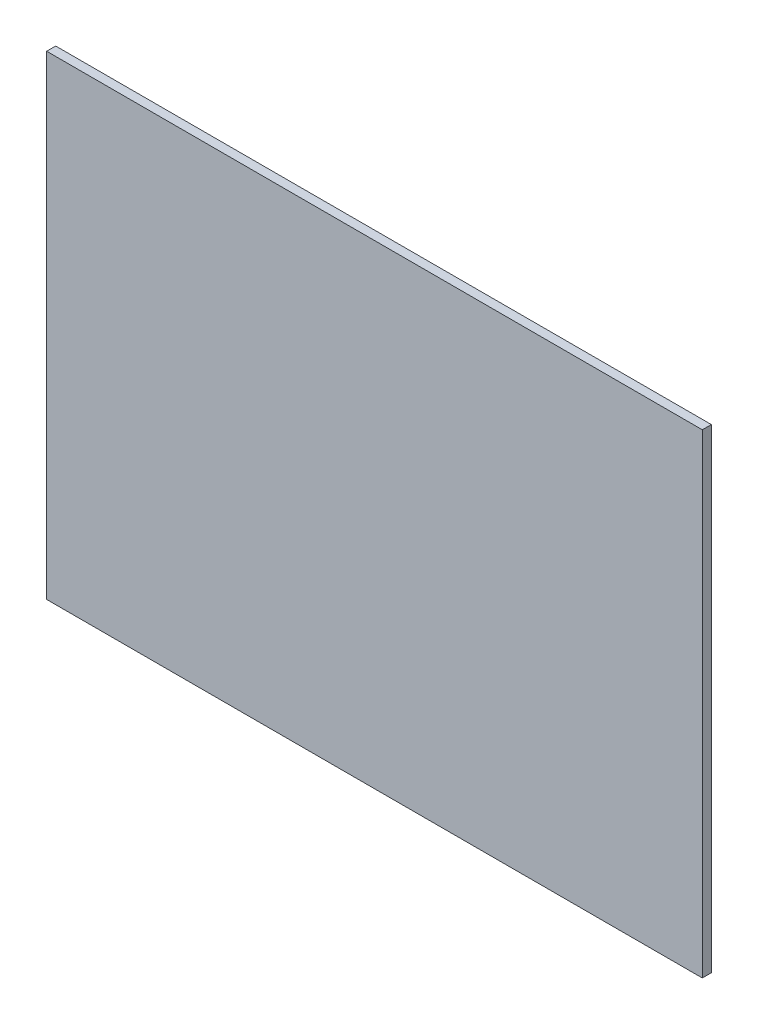
ISO-10303-21;
HEADER;
FILE_DESCRIPTION(('STEP AP214'),'2;1');
FILE_NAME('part.step','',(''),(''),'','','');
FILE_SCHEMA(('AUTOMOTIVE_DESIGN { 1 0 10303 214 1 1 1 1 }'));
ENDSEC;
DATA;
#1=APPLICATION_CONTEXT('core data for automotive mechanical design processes');
#2=APPLICATION_PROTOCOL_DEFINITION('international standard','automotive_design',2000,#1);
#3=PRODUCT_CONTEXT('',#1,'mechanical');
#4=PRODUCT('Part','Part','',(#3));
#5=PRODUCT_RELATED_PRODUCT_CATEGORY('part','',(#4));
#6=PRODUCT_DEFINITION_FORMATION('','',#4);
#7=PRODUCT_DEFINITION_CONTEXT('part definition',#1,'design');
#8=PRODUCT_DEFINITION('design','',#6,#7);
#9=PRODUCT_DEFINITION_SHAPE('','',#8);
#10=(LENGTH_UNIT() NAMED_UNIT(*) SI_UNIT(.MILLI.,.METRE.));
#11=(NAMED_UNIT(*) PLANE_ANGLE_UNIT() SI_UNIT($,.RADIAN.));
#12=(NAMED_UNIT(*) SI_UNIT($,.STERADIAN.) SOLID_ANGLE_UNIT());
#13=UNCERTAINTY_MEASURE_WITH_UNIT(LENGTH_MEASURE(1.E-05),#10,'distance_accuracy_value','');
#14=(GEOMETRIC_REPRESENTATION_CONTEXT(3) GLOBAL_UNCERTAINTY_ASSIGNED_CONTEXT((#13)) GLOBAL_UNIT_ASSIGNED_CONTEXT((#10,
#11,#12)) REPRESENTATION_CONTEXT('',''));
#15=CARTESIAN_POINT('',(0.,0.,0.));
#16=DIRECTION('',(0.,0.,1.));
#17=DIRECTION('',(1.,0.,0.));
#18=AXIS2_PLACEMENT_3D('',#15,#16,#17);
#19=CARTESIAN_POINT('',(-145.,105.,4.));
#20=DIRECTION('',(1.,0.,0.));
#21=DIRECTION('',(0.,1.,0.));
#22=AXIS2_PLACEMENT_3D('',#19,#20,#21);
#23=PLANE('',#22);
#24=DIRECTION('',(0.,-1.,0.));
#25=VECTOR('',#24,1.);
#26=CARTESIAN_POINT('',(-145.,105.,0.));
#27=LINE('',#26,#25);
#28=CARTESIAN_POINT('',(-145.,105.,0.));
#29=VERTEX_POINT('',#28);
#30=CARTESIAN_POINT('',(-145.000000000001,-105.,0.));
#31=VERTEX_POINT('',#30);
#32=EDGE_CURVE('E91',#29,#31,#27,.T.);
#33=ORIENTED_EDGE('',*,*,#32,.T.);
#34=DIRECTION('',(0.,0.,-1.));
#35=VECTOR('',#34,1.);
#36=CARTESIAN_POINT('',(-145.000000000001,-105.,4.));
#37=LINE('',#36,#35);
#38=CARTESIAN_POINT('',(-145.000000000001,-105.,4.));
#39=VERTEX_POINT('',#38);
#40=EDGE_CURVE('E11',#39,#31,#37,.T.);
#41=ORIENTED_EDGE('',*,*,#40,.F.);
#42=DIRECTION('',(0.,-1.,0.));
#43=VECTOR('',#42,1.);
#44=CARTESIAN_POINT('',(-145.,105.,4.));
#45=LINE('',#44,#43);
#46=CARTESIAN_POINT('',(-145.,105.,4.));
#47=VERTEX_POINT('',#46);
#48=EDGE_CURVE('E79',#47,#39,#45,.T.);
#49=ORIENTED_EDGE('',*,*,#48,.F.);
#50=DIRECTION('',(0.,0.,-1.));
#51=VECTOR('',#50,1.);
#52=CARTESIAN_POINT('',(-145.,105.,4.));
#53=LINE('',#52,#51);
#54=EDGE_CURVE('E87',#47,#29,#53,.T.);
#55=ORIENTED_EDGE('',*,*,#54,.T.);
#56=EDGE_LOOP('',(#33,#41,#49,#55));
#57=FACE_BOUND('',#56,.T.);
#58=ADVANCED_FACE('F28',(#57),#23,.F.);
#59=CARTESIAN_POINT('',(-145.000000000001,-105.,4.));
#60=DIRECTION('',(0.,1.,0.));
#61=DIRECTION('',(0.,0.,1.));
#62=AXIS2_PLACEMENT_3D('',#59,#60,#61);
#63=PLANE('',#62);
#64=DIRECTION('',(1.,0.,0.));
#65=VECTOR('',#64,1.);
#66=CARTESIAN_POINT('',(-145.000000000001,-105.,0.));
#67=LINE('',#66,#65);
#68=CARTESIAN_POINT('',(145.,-105.,0.));
#69=VERTEX_POINT('',#68);
#70=EDGE_CURVE('E83',#31,#69,#67,.T.);
#71=ORIENTED_EDGE('',*,*,#70,.T.);
#72=DIRECTION('',(0.,0.,-1.));
#73=VECTOR('',#72,1.);
#74=CARTESIAN_POINT('',(145.,-105.,4.));
#75=LINE('',#74,#73);
#76=CARTESIAN_POINT('',(145.,-105.,4.));
#77=VERTEX_POINT('',#76);
#78=EDGE_CURVE('E36',#77,#69,#75,.T.);
#79=ORIENTED_EDGE('',*,*,#78,.F.);
#80=DIRECTION('',(1.,0.,0.));
#81=VECTOR('',#80,1.);
#82=CARTESIAN_POINT('',(-145.000000000001,-105.,4.));
#83=LINE('',#82,#81);
#84=EDGE_CURVE('E74',#39,#77,#83,.T.);
#85=ORIENTED_EDGE('',*,*,#84,.F.);
#86=ORIENTED_EDGE('',*,*,#40,.T.);
#87=EDGE_LOOP('',(#71,#79,#85,#86));
#88=FACE_BOUND('',#87,.T.);
#89=ADVANCED_FACE('F82',(#88),#63,.F.);
#90=CARTESIAN_POINT('',(145.,105.,4.));
#91=DIRECTION('',(-1.,0.,0.));
#92=DIRECTION('',(0.,-1.,0.));
#93=AXIS2_PLACEMENT_3D('',#90,#91,#92);
#94=PLANE('',#93);
#95=DIRECTION('',(0.,1.,0.));
#96=VECTOR('',#95,1.);
#97=CARTESIAN_POINT('',(145.,105.,0.));
#98=LINE('',#97,#96);
#99=CARTESIAN_POINT('',(145.,105.,0.));
#100=VERTEX_POINT('',#99);
#101=EDGE_CURVE('E61',#69,#100,#98,.T.);
#102=ORIENTED_EDGE('',*,*,#101,.T.);
#103=DIRECTION('',(0.,0.,-1.));
#104=VECTOR('',#103,1.);
#105=CARTESIAN_POINT('',(145.,105.,4.));
#106=LINE('',#105,#104);
#107=CARTESIAN_POINT('',(145.,105.,4.));
#108=VERTEX_POINT('',#107);
#109=EDGE_CURVE('E84',#108,#100,#106,.T.);
#110=ORIENTED_EDGE('',*,*,#109,.F.);
#111=DIRECTION('',(0.,1.,0.));
#112=VECTOR('',#111,1.);
#113=CARTESIAN_POINT('',(145.,105.,4.));
#114=LINE('',#113,#112);
#115=EDGE_CURVE('E77',#77,#108,#114,.T.);
#116=ORIENTED_EDGE('',*,*,#115,.F.);
#117=ORIENTED_EDGE('',*,*,#78,.T.);
#118=EDGE_LOOP('',(#102,#110,#116,#117));
#119=FACE_BOUND('',#118,.T.);
#120=ADVANCED_FACE('F85',(#119),#94,.F.);
#121=CARTESIAN_POINT('',(-145.,105.,4.));
#122=DIRECTION('',(0.,-1.,0.));
#123=DIRECTION('',(0.,0.,-1.));
#124=AXIS2_PLACEMENT_3D('',#121,#122,#123);
#125=PLANE('',#124);
#126=DIRECTION('',(-1.,0.,0.));
#127=VECTOR('',#126,1.);
#128=CARTESIAN_POINT('',(-145.,105.,0.));
#129=LINE('',#128,#127);
#130=EDGE_CURVE('E67',#100,#29,#129,.T.);
#131=ORIENTED_EDGE('',*,*,#130,.T.);
#132=ORIENTED_EDGE('',*,*,#54,.F.);
#133=DIRECTION('',(-1.,0.,0.));
#134=VECTOR('',#133,1.);
#135=CARTESIAN_POINT('',(-145.,105.,4.));
#136=LINE('',#135,#134);
#137=EDGE_CURVE('E44',#108,#47,#136,.T.);
#138=ORIENTED_EDGE('',*,*,#137,.F.);
#139=ORIENTED_EDGE('',*,*,#109,.T.);
#140=EDGE_LOOP('',(#131,#132,#138,#139));
#141=FACE_BOUND('',#140,.T.);
#142=ADVANCED_FACE('F98',(#141),#125,.F.);
#143=CARTESIAN_POINT('',(0.,0.,4.));
#144=DIRECTION('',(0.,0.,1.));
#145=DIRECTION('',(1.,0.,0.));
#146=AXIS2_PLACEMENT_3D('',#143,#144,#145);
#147=PLANE('',#146);
#148=ORIENTED_EDGE('',*,*,#48,.T.);
#149=ORIENTED_EDGE('',*,*,#84,.T.);
#150=ORIENTED_EDGE('',*,*,#115,.T.);
#151=ORIENTED_EDGE('',*,*,#137,.T.);
#152=EDGE_LOOP('',(#148,#149,#150,#151));
#153=FACE_BOUND('',#152,.T.);
#154=ADVANCED_FACE('F75',(#153),#147,.T.);
#155=CARTESIAN_POINT('',(0.,0.,0.));
#156=DIRECTION('',(0.,0.,1.));
#157=DIRECTION('',(1.,0.,0.));
#158=AXIS2_PLACEMENT_3D('',#155,#156,#157);
#159=PLANE('',#158);
#160=ORIENTED_EDGE('',*,*,#32,.F.);
#161=ORIENTED_EDGE('',*,*,#130,.F.);
#162=ORIENTED_EDGE('',*,*,#101,.F.);
#163=ORIENTED_EDGE('',*,*,#70,.F.);
#164=EDGE_LOOP('',(#160,#161,#162,#163));
#165=FACE_BOUND('',#164,.T.);
#166=ADVANCED_FACE('F101',(#165),#159,.F.);
#167=CLOSED_SHELL('',(#58,#89,#120,#142,#154,#166));
#168=MANIFOLD_SOLID_BREP('B2',#167);
#169=ADVANCED_BREP_SHAPE_REPRESENTATION('',(#18,#168),#14);
#170=SHAPE_DEFINITION_REPRESENTATION(#9,#169);
ENDSEC;
END-ISO-10303-21;
